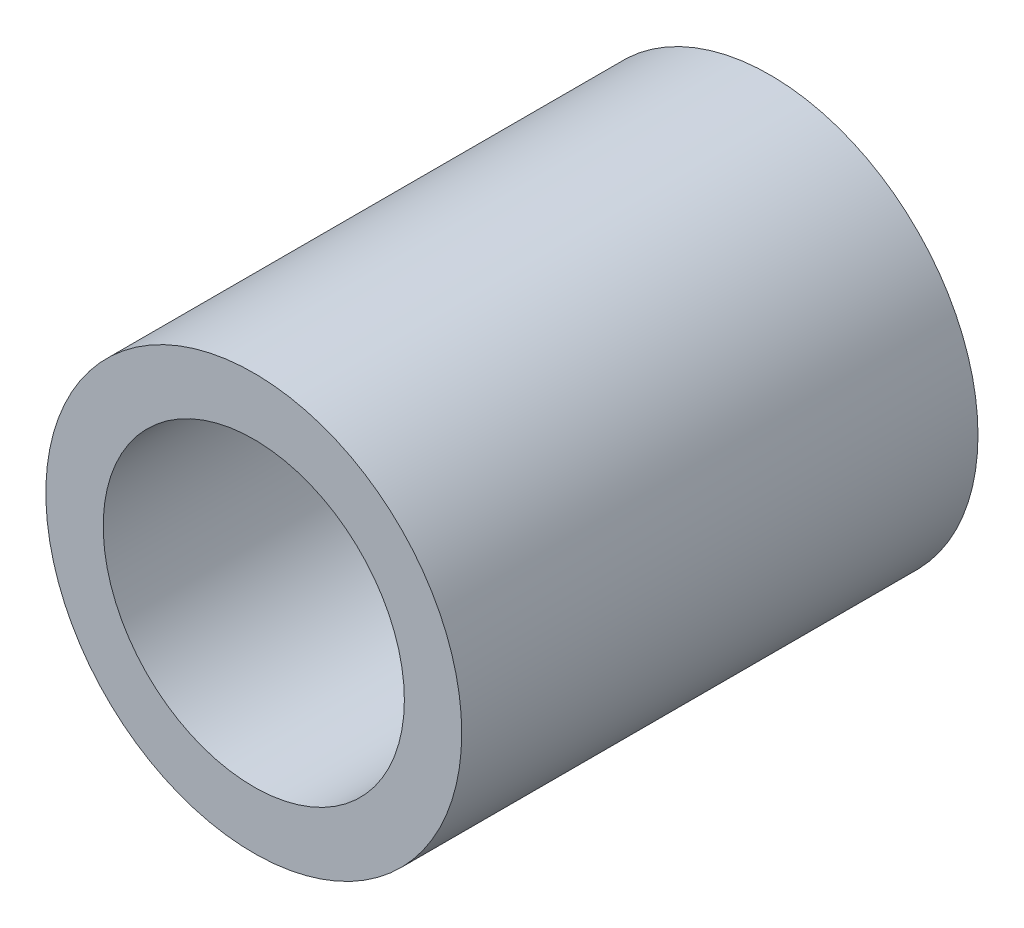
ISO-10303-21;
HEADER;
FILE_DESCRIPTION(('STEP AP214'),'2;1');
FILE_NAME('part.step','',(''),(''),'','','');
FILE_SCHEMA(('AUTOMOTIVE_DESIGN { 1 0 10303 214 1 1 1 1 }'));
ENDSEC;
DATA;
#1=APPLICATION_CONTEXT('core data for automotive mechanical design processes');
#2=APPLICATION_PROTOCOL_DEFINITION('international standard','automotive_design',2000,#1);
#3=PRODUCT_CONTEXT('',#1,'mechanical');
#4=PRODUCT('Part','Part','',(#3));
#5=PRODUCT_RELATED_PRODUCT_CATEGORY('part','',(#4));
#6=PRODUCT_DEFINITION_FORMATION('','',#4);
#7=PRODUCT_DEFINITION_CONTEXT('part definition',#1,'design');
#8=PRODUCT_DEFINITION('design','',#6,#7);
#9=PRODUCT_DEFINITION_SHAPE('','',#8);
#10=(LENGTH_UNIT() NAMED_UNIT(*) SI_UNIT(.MILLI.,.METRE.));
#11=(NAMED_UNIT(*) PLANE_ANGLE_UNIT() SI_UNIT($,.RADIAN.));
#12=(NAMED_UNIT(*) SI_UNIT($,.STERADIAN.) SOLID_ANGLE_UNIT());
#13=UNCERTAINTY_MEASURE_WITH_UNIT(LENGTH_MEASURE(1.E-05),#10,'distance_accuracy_value','');
#14=(GEOMETRIC_REPRESENTATION_CONTEXT(3) GLOBAL_UNCERTAINTY_ASSIGNED_CONTEXT((#13)) GLOBAL_UNIT_ASSIGNED_CONTEXT((#10,
#11,#12)) REPRESENTATION_CONTEXT('',''));
#15=CARTESIAN_POINT('',(0.,0.,0.));
#16=DIRECTION('',(0.,0.,1.));
#17=DIRECTION('',(1.,0.,0.));
#18=AXIS2_PLACEMENT_3D('',#15,#16,#17);
#19=CARTESIAN_POINT('',(-4.43563863815735,1.80476888516139,18.));
#20=DIRECTION('',(0.,0.,1.));
#21=DIRECTION('',(1.,0.,0.));
#22=AXIS2_PLACEMENT_3D('',#19,#20,#21);
#23=PLANE('',#22);
#24=CARTESIAN_POINT('',(-4.43563863815735,1.80476888516139,18.));
#25=DIRECTION('',(0.,0.,1.));
#26=DIRECTION('',(1.,0.,0.));
#27=AXIS2_PLACEMENT_3D('',#24,#25,#26);
#28=CIRCLE('',#27,7.25);
#29=CARTESIAN_POINT('',(2.81436136184265,1.80476888516139,18.));
#30=VERTEX_POINT('',#29);
#31=EDGE_CURVE('E10',#30,#30,#28,.T.);
#32=ORIENTED_EDGE('',*,*,#31,.T.);
#33=EDGE_LOOP('',(#32));
#34=FACE_BOUND('',#33,.T.);
#35=CARTESIAN_POINT('',(-4.43563863815735,1.80476888516139,18.));
#36=DIRECTION('',(0.,0.,1.));
#37=DIRECTION('',(1.,0.,0.));
#38=AXIS2_PLACEMENT_3D('',#35,#36,#37);
#39=CIRCLE('',#38,5.25);
#40=CARTESIAN_POINT('',(0.814361361842653,1.80476888516139,18.));
#41=VERTEX_POINT('',#40);
#42=EDGE_CURVE('E45',#41,#41,#39,.T.);
#43=ORIENTED_EDGE('',*,*,#42,.F.);
#44=EDGE_LOOP('',(#43));
#45=FACE_BOUND('',#44,.T.);
#46=ADVANCED_FACE('F34',(#34,#45),#23,.T.);
#47=CARTESIAN_POINT('',(-4.43563863815735,1.80476888516139,0.));
#48=DIRECTION('',(0.,0.,1.));
#49=DIRECTION('',(1.,0.,0.));
#50=AXIS2_PLACEMENT_3D('',#47,#48,#49);
#51=PLANE('',#50);
#52=CARTESIAN_POINT('',(-4.43563863815735,1.80476888516139,0.));
#53=DIRECTION('',(0.,0.,1.));
#54=DIRECTION('',(1.,0.,0.));
#55=AXIS2_PLACEMENT_3D('',#52,#53,#54);
#56=CIRCLE('',#55,7.25);
#57=CARTESIAN_POINT('',(2.81436136184265,1.80476888516139,0.));
#58=VERTEX_POINT('',#57);
#59=EDGE_CURVE('E38',#58,#58,#56,.T.);
#60=ORIENTED_EDGE('',*,*,#59,.F.);
#61=EDGE_LOOP('',(#60));
#62=FACE_BOUND('',#61,.T.);
#63=CARTESIAN_POINT('',(-4.43563863815735,1.80476888516139,0.));
#64=DIRECTION('',(0.,0.,1.));
#65=DIRECTION('',(1.,0.,0.));
#66=AXIS2_PLACEMENT_3D('',#63,#64,#65);
#67=CIRCLE('',#66,5.25);
#68=CARTESIAN_POINT('',(0.814361361842653,1.80476888516139,0.));
#69=VERTEX_POINT('',#68);
#70=EDGE_CURVE('E47',#69,#69,#67,.T.);
#71=ORIENTED_EDGE('',*,*,#70,.T.);
#72=EDGE_LOOP('',(#71));
#73=FACE_BOUND('',#72,.T.);
#74=ADVANCED_FACE('F57',(#62,#73),#51,.F.);
#75=CARTESIAN_POINT('',(-4.43563863815735,1.80476888516139,18.));
#76=DIRECTION('',(0.,0.,-1.));
#77=DIRECTION('',(-1.,0.,0.));
#78=AXIS2_PLACEMENT_3D('',#75,#76,#77);
#79=CYLINDRICAL_SURFACE('',#78,7.25);
#80=ORIENTED_EDGE('',*,*,#31,.F.);
#81=EDGE_LOOP('',(#80));
#82=FACE_BOUND('',#81,.T.);
#83=ORIENTED_EDGE('',*,*,#59,.T.);
#84=EDGE_LOOP('',(#83));
#85=FACE_BOUND('',#84,.T.);
#86=ADVANCED_FACE('F36',(#82,#85),#79,.T.);
#87=CARTESIAN_POINT('',(-4.43563863815735,1.80476888516139,18.));
#88=DIRECTION('',(0.,0.,-1.));
#89=DIRECTION('',(-1.,0.,0.));
#90=AXIS2_PLACEMENT_3D('',#87,#88,#89);
#91=CYLINDRICAL_SURFACE('',#90,5.25);
#92=ORIENTED_EDGE('',*,*,#42,.T.);
#93=EDGE_LOOP('',(#92));
#94=FACE_BOUND('',#93,.T.);
#95=ORIENTED_EDGE('',*,*,#70,.F.);
#96=EDGE_LOOP('',(#95));
#97=FACE_BOUND('',#96,.T.);
#98=ADVANCED_FACE('F53',(#94,#97),#91,.F.);
#99=CLOSED_SHELL('',(#46,#74,#86,#98));
#100=MANIFOLD_SOLID_BREP('B2',#99);
#101=ADVANCED_BREP_SHAPE_REPRESENTATION('',(#18,#100),#14);
#102=SHAPE_DEFINITION_REPRESENTATION(#9,#101);
ENDSEC;
END-ISO-10303-21;
